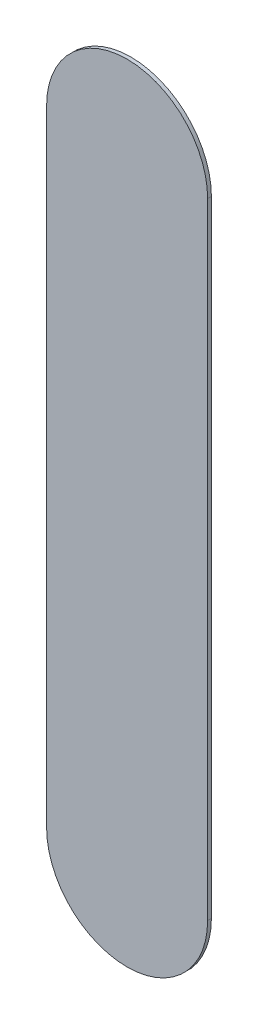
ISO-10303-21;
HEADER;
FILE_DESCRIPTION(('STEP AP214'),'2;1');
FILE_NAME('part.step','',(''),(''),'','','');
FILE_SCHEMA(('AUTOMOTIVE_DESIGN { 1 0 10303 214 1 1 1 1 }'));
ENDSEC;
DATA;
#1=APPLICATION_CONTEXT('core data for automotive mechanical design processes');
#2=APPLICATION_PROTOCOL_DEFINITION('international standard','automotive_design',2000,#1);
#3=PRODUCT_CONTEXT('',#1,'mechanical');
#4=PRODUCT('Part','Part','',(#3));
#5=PRODUCT_RELATED_PRODUCT_CATEGORY('part','',(#4));
#6=PRODUCT_DEFINITION_FORMATION('','',#4);
#7=PRODUCT_DEFINITION_CONTEXT('part definition',#1,'design');
#8=PRODUCT_DEFINITION('design','',#6,#7);
#9=PRODUCT_DEFINITION_SHAPE('','',#8);
#10=(LENGTH_UNIT() NAMED_UNIT(*) SI_UNIT(.MILLI.,.METRE.));
#11=(NAMED_UNIT(*) PLANE_ANGLE_UNIT() SI_UNIT($,.RADIAN.));
#12=(NAMED_UNIT(*) SI_UNIT($,.STERADIAN.) SOLID_ANGLE_UNIT());
#13=UNCERTAINTY_MEASURE_WITH_UNIT(LENGTH_MEASURE(1.E-05),#10,'distance_accuracy_value','');
#14=(GEOMETRIC_REPRESENTATION_CONTEXT(3) GLOBAL_UNCERTAINTY_ASSIGNED_CONTEXT((#13)) GLOBAL_UNIT_ASSIGNED_CONTEXT((#10,
#11,#12)) REPRESENTATION_CONTEXT('',''));
#15=CARTESIAN_POINT('',(0.,0.,0.));
#16=DIRECTION('',(0.,0.,1.));
#17=DIRECTION('',(1.,0.,0.));
#18=AXIS2_PLACEMENT_3D('',#15,#16,#17);
#19=CARTESIAN_POINT('',(-31.175,-4.075,1.635));
#20=DIRECTION('',(0.,0.,1.));
#21=DIRECTION('',(1.,0.,0.));
#22=AXIS2_PLACEMENT_3D('',#19,#20,#21);
#23=PLANE('',#22);
#24=DIRECTION('',(0.,1.,0.));
#25=VECTOR('',#24,1.);
#26=CARTESIAN_POINT('',(-31.175,-4.075,1.635));
#27=LINE('',#26,#25);
#28=CARTESIAN_POINT('',(-31.175,-4.075,1.635));
#29=VERTEX_POINT('',#28);
#30=CARTESIAN_POINT('',(-31.175,1.75,1.635));
#31=VERTEX_POINT('',#30);
#32=EDGE_CURVE('E66',#29,#31,#27,.T.);
#33=ORIENTED_EDGE('',*,*,#32,.T.);
#34=CARTESIAN_POINT('',(-31.925,1.75,1.635));
#35=DIRECTION('',(0.,0.,1.));
#36=DIRECTION('',(1.,0.,0.));
#37=AXIS2_PLACEMENT_3D('',#34,#35,#36);
#38=CIRCLE('',#37,0.75);
#39=CARTESIAN_POINT('',(-32.675,1.75,1.635));
#40=VERTEX_POINT('',#39);
#41=EDGE_CURVE('E92',#31,#40,#38,.T.);
#42=ORIENTED_EDGE('',*,*,#41,.T.);
#43=DIRECTION('',(0.,-1.,0.));
#44=VECTOR('',#43,1.);
#45=CARTESIAN_POINT('',(-32.675,1.75,1.635));
#46=LINE('',#45,#44);
#47=CARTESIAN_POINT('',(-32.675,-4.075,1.635));
#48=VERTEX_POINT('',#47);
#49=EDGE_CURVE('E68',#40,#48,#46,.T.);
#50=ORIENTED_EDGE('',*,*,#49,.T.);
#51=CARTESIAN_POINT('',(-31.925,-4.075,1.635));
#52=DIRECTION('',(0.,0.,1.));
#53=DIRECTION('',(-1.,0.,0.));
#54=AXIS2_PLACEMENT_3D('',#51,#52,#53);
#55=CIRCLE('',#54,0.75);
#56=EDGE_CURVE('E11',#48,#29,#55,.T.);
#57=ORIENTED_EDGE('',*,*,#56,.T.);
#58=EDGE_LOOP('',(#33,#42,#50,#57));
#59=FACE_BOUND('',#58,.T.);
#60=ADVANCED_FACE('F16',(#59),#23,.T.);
#61=CARTESIAN_POINT('',(-31.175,-4.075,1.6));
#62=DIRECTION('',(0.,0.,1.));
#63=DIRECTION('',(1.,0.,0.));
#64=AXIS2_PLACEMENT_3D('',#61,#62,#63);
#65=PLANE('',#64);
#66=CARTESIAN_POINT('',(-31.925,-4.075,1.6));
#67=DIRECTION('',(0.,0.,1.));
#68=DIRECTION('',(-1.,0.,0.));
#69=AXIS2_PLACEMENT_3D('',#66,#67,#68);
#70=CIRCLE('',#69,0.75);
#71=CARTESIAN_POINT('',(-32.675,-4.075,1.6));
#72=VERTEX_POINT('',#71);
#73=CARTESIAN_POINT('',(-31.175,-4.075,1.6));
#74=VERTEX_POINT('',#73);
#75=EDGE_CURVE('E26',#72,#74,#70,.T.);
#76=ORIENTED_EDGE('',*,*,#75,.F.);
#77=DIRECTION('',(0.,-1.,0.));
#78=VECTOR('',#77,1.);
#79=CARTESIAN_POINT('',(-32.675,1.75,1.6));
#80=LINE('',#79,#78);
#81=CARTESIAN_POINT('',(-32.675,1.75,1.6));
#82=VERTEX_POINT('',#81);
#83=EDGE_CURVE('E106',#82,#72,#80,.T.);
#84=ORIENTED_EDGE('',*,*,#83,.F.);
#85=CARTESIAN_POINT('',(-31.925,1.75,1.6));
#86=DIRECTION('',(0.,0.,1.));
#87=DIRECTION('',(1.,0.,0.));
#88=AXIS2_PLACEMENT_3D('',#85,#86,#87);
#89=CIRCLE('',#88,0.75);
#90=CARTESIAN_POINT('',(-31.175,1.75,1.6));
#91=VERTEX_POINT('',#90);
#92=EDGE_CURVE('E77',#91,#82,#89,.T.);
#93=ORIENTED_EDGE('',*,*,#92,.F.);
#94=DIRECTION('',(0.,1.,0.));
#95=VECTOR('',#94,1.);
#96=CARTESIAN_POINT('',(-31.175,-4.075,1.6));
#97=LINE('',#96,#95);
#98=EDGE_CURVE('E88',#74,#91,#97,.T.);
#99=ORIENTED_EDGE('',*,*,#98,.F.);
#100=EDGE_LOOP('',(#76,#84,#93,#99));
#101=FACE_BOUND('',#100,.T.);
#102=ADVANCED_FACE('F18',(#101),#65,.F.);
#103=CARTESIAN_POINT('',(-31.925,-4.075,1.6));
#104=DIRECTION('',(0.,0.,-1.));
#105=DIRECTION('',(-1.,0.,0.));
#106=AXIS2_PLACEMENT_3D('',#103,#104,#105);
#107=CYLINDRICAL_SURFACE('',#106,0.75);
#108=ORIENTED_EDGE('',*,*,#75,.T.);
#109=DIRECTION('',(0.,0.,1.));
#110=VECTOR('',#109,1.);
#111=CARTESIAN_POINT('',(-31.175,-4.075,1.6));
#112=LINE('',#111,#110);
#113=EDGE_CURVE('E71',#74,#29,#112,.T.);
#114=ORIENTED_EDGE('',*,*,#113,.T.);
#115=ORIENTED_EDGE('',*,*,#56,.F.);
#116=DIRECTION('',(0.,0.,1.));
#117=VECTOR('',#116,1.);
#118=CARTESIAN_POINT('',(-32.675,-4.075,1.6));
#119=LINE('',#118,#117);
#120=EDGE_CURVE('E103',#72,#48,#119,.T.);
#121=ORIENTED_EDGE('',*,*,#120,.F.);
#122=EDGE_LOOP('',(#108,#114,#115,#121));
#123=FACE_BOUND('',#122,.T.);
#124=ADVANCED_FACE('F72',(#123),#107,.T.);
#125=CARTESIAN_POINT('',(-32.675,1.75,1.6));
#126=DIRECTION('',(1.,0.,0.));
#127=DIRECTION('',(0.,1.,0.));
#128=AXIS2_PLACEMENT_3D('',#125,#126,#127);
#129=PLANE('',#128);
#130=ORIENTED_EDGE('',*,*,#83,.T.);
#131=ORIENTED_EDGE('',*,*,#120,.T.);
#132=ORIENTED_EDGE('',*,*,#49,.F.);
#133=DIRECTION('',(0.,0.,1.));
#134=VECTOR('',#133,1.);
#135=CARTESIAN_POINT('',(-32.675,1.75,1.6));
#136=LINE('',#135,#134);
#137=EDGE_CURVE('E94',#82,#40,#136,.T.);
#138=ORIENTED_EDGE('',*,*,#137,.F.);
#139=EDGE_LOOP('',(#130,#131,#132,#138));
#140=FACE_BOUND('',#139,.T.);
#141=ADVANCED_FACE('F150',(#140),#129,.F.);
#142=CARTESIAN_POINT('',(-31.925,1.75,1.6));
#143=DIRECTION('',(0.,0.,-1.));
#144=DIRECTION('',(1.,0.,0.));
#145=AXIS2_PLACEMENT_3D('',#142,#143,#144);
#146=CYLINDRICAL_SURFACE('',#145,0.75);
#147=ORIENTED_EDGE('',*,*,#92,.T.);
#148=ORIENTED_EDGE('',*,*,#137,.T.);
#149=ORIENTED_EDGE('',*,*,#41,.F.);
#150=DIRECTION('',(0.,0.,1.));
#151=VECTOR('',#150,1.);
#152=CARTESIAN_POINT('',(-31.175,1.75,1.6));
#153=LINE('',#152,#151);
#154=EDGE_CURVE('E81',#91,#31,#153,.T.);
#155=ORIENTED_EDGE('',*,*,#154,.F.);
#156=EDGE_LOOP('',(#147,#148,#149,#155));
#157=FACE_BOUND('',#156,.T.);
#158=ADVANCED_FACE('F148',(#157),#146,.T.);
#159=CARTESIAN_POINT('',(-31.175,-4.075,1.6));
#160=DIRECTION('',(-1.,0.,0.));
#161=DIRECTION('',(0.,0.,1.));
#162=AXIS2_PLACEMENT_3D('',#159,#160,#161);
#163=PLANE('',#162);
#164=ORIENTED_EDGE('',*,*,#98,.T.);
#165=ORIENTED_EDGE('',*,*,#154,.T.);
#166=ORIENTED_EDGE('',*,*,#32,.F.);
#167=ORIENTED_EDGE('',*,*,#113,.F.);
#168=EDGE_LOOP('',(#164,#165,#166,#167));
#169=FACE_BOUND('',#168,.T.);
#170=ADVANCED_FACE('F79',(#169),#163,.F.);
#171=CLOSED_SHELL('',(#60,#102,#124,#141,#158,#170));
#172=MANIFOLD_SOLID_BREP('B1',#171);
#173=ADVANCED_BREP_SHAPE_REPRESENTATION('',(#18,#172),#14);
#174=SHAPE_DEFINITION_REPRESENTATION(#9,#173);
ENDSEC;
END-ISO-10303-21;
